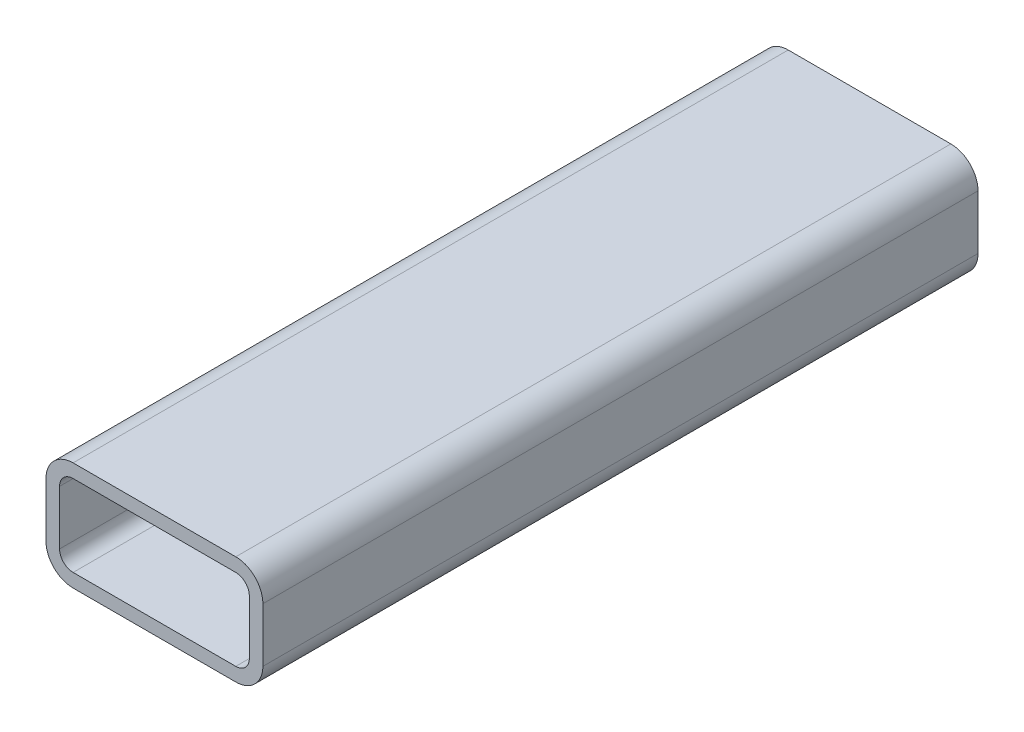
ISO-10303-21;
HEADER;
FILE_DESCRIPTION(('STEP AP214'),'2;1');
FILE_NAME('part.step','',(''),(''),'','','');
FILE_SCHEMA(('AUTOMOTIVE_DESIGN { 1 0 10303 214 1 1 1 1 }'));
ENDSEC;
DATA;
#1=APPLICATION_CONTEXT('core data for automotive mechanical design processes');
#2=APPLICATION_PROTOCOL_DEFINITION('international standard','automotive_design',2000,#1);
#3=PRODUCT_CONTEXT('',#1,'mechanical');
#4=PRODUCT('Part','Part','',(#3));
#5=PRODUCT_RELATED_PRODUCT_CATEGORY('part','',(#4));
#6=PRODUCT_DEFINITION_FORMATION('','',#4);
#7=PRODUCT_DEFINITION_CONTEXT('part definition',#1,'design');
#8=PRODUCT_DEFINITION('design','',#6,#7);
#9=PRODUCT_DEFINITION_SHAPE('','',#8);
#10=(LENGTH_UNIT() NAMED_UNIT(*) SI_UNIT(.MILLI.,.METRE.));
#11=(NAMED_UNIT(*) PLANE_ANGLE_UNIT() SI_UNIT($,.RADIAN.));
#12=(NAMED_UNIT(*) SI_UNIT($,.STERADIAN.) SOLID_ANGLE_UNIT());
#13=UNCERTAINTY_MEASURE_WITH_UNIT(LENGTH_MEASURE(1.E-05),#10,'distance_accuracy_value','');
#14=(GEOMETRIC_REPRESENTATION_CONTEXT(3) GLOBAL_UNCERTAINTY_ASSIGNED_CONTEXT((#13)) GLOBAL_UNIT_ASSIGNED_CONTEXT((#10,
#11,#12)) REPRESENTATION_CONTEXT('',''));
#15=CARTESIAN_POINT('',(0.,0.,0.));
#16=DIRECTION('',(0.,0.,1.));
#17=DIRECTION('',(1.,0.,0.));
#18=AXIS2_PLACEMENT_3D('',#15,#16,#17);
#19=CARTESIAN_POINT('',(76.2,25.4,670.));
#20=DIRECTION('',(0.,0.,1.));
#21=DIRECTION('',(1.,0.,0.));
#22=AXIS2_PLACEMENT_3D('',#19,#20,#21);
#23=PLANE('',#22);
#24=CARTESIAN_POINT('',(76.2,25.4,670.));
#25=DIRECTION('',(0.,0.,1.));
#26=DIRECTION('',(1.,0.,0.));
#27=AXIS2_PLACEMENT_3D('',#24,#25,#26);
#28=CIRCLE('',#27,25.4);
#29=CARTESIAN_POINT('',(101.6,25.3999999999999,670.));
#30=VERTEX_POINT('',#29);
#31=CARTESIAN_POINT('',(76.2,50.8,670.));
#32=VERTEX_POINT('',#31);
#33=EDGE_CURVE('E210',#30,#32,#28,.T.);
#34=ORIENTED_EDGE('',*,*,#33,.T.);
#35=DIRECTION('',(-1.,0.,0.));
#36=VECTOR('',#35,1.);
#37=CARTESIAN_POINT('',(76.2,50.8,670.));
#38=LINE('',#37,#36);
#39=CARTESIAN_POINT('',(-76.2,50.8,670.));
#40=VERTEX_POINT('',#39);
#41=EDGE_CURVE('E213',#32,#40,#38,.T.);
#42=ORIENTED_EDGE('',*,*,#41,.T.);
#43=CARTESIAN_POINT('',(-76.2,25.4,670.));
#44=DIRECTION('',(0.,0.,1.));
#45=DIRECTION('',(1.,0.,0.));
#46=AXIS2_PLACEMENT_3D('',#43,#44,#45);
#47=CIRCLE('',#46,25.4);
#48=CARTESIAN_POINT('',(-101.6,25.4,670.));
#49=VERTEX_POINT('',#48);
#50=EDGE_CURVE('E216',#40,#49,#47,.T.);
#51=ORIENTED_EDGE('',*,*,#50,.T.);
#52=DIRECTION('',(0.,-1.,0.));
#53=VECTOR('',#52,1.);
#54=CARTESIAN_POINT('',(-101.6,-25.4,670.));
#55=LINE('',#54,#53);
#56=CARTESIAN_POINT('',(-101.6,-25.4,670.));
#57=VERTEX_POINT('',#56);
#58=EDGE_CURVE('E218',#49,#57,#55,.T.);
#59=ORIENTED_EDGE('',*,*,#58,.T.);
#60=CARTESIAN_POINT('',(-76.2,-25.4,670.));
#61=DIRECTION('',(0.,0.,1.));
#62=DIRECTION('',(1.,0.,0.));
#63=AXIS2_PLACEMENT_3D('',#60,#61,#62);
#64=CIRCLE('',#63,25.4);
#65=CARTESIAN_POINT('',(-76.2,-50.8,670.));
#66=VERTEX_POINT('',#65);
#67=EDGE_CURVE('E220',#57,#66,#64,.T.);
#68=ORIENTED_EDGE('',*,*,#67,.T.);
#69=DIRECTION('',(1.,0.,0.));
#70=VECTOR('',#69,1.);
#71=CARTESIAN_POINT('',(-76.2,-50.8,670.));
#72=LINE('',#71,#70);
#73=CARTESIAN_POINT('',(76.2,-50.8000000000001,670.));
#74=VERTEX_POINT('',#73);
#75=EDGE_CURVE('E222',#66,#74,#72,.T.);
#76=ORIENTED_EDGE('',*,*,#75,.T.);
#77=CARTESIAN_POINT('',(76.2,-25.4,670.));
#78=DIRECTION('',(0.,0.,1.));
#79=DIRECTION('',(1.,0.,0.));
#80=AXIS2_PLACEMENT_3D('',#77,#78,#79);
#81=CIRCLE('',#80,25.4);
#82=CARTESIAN_POINT('',(101.6,-25.4000000000001,670.));
#83=VERTEX_POINT('',#82);
#84=EDGE_CURVE('E224',#74,#83,#81,.T.);
#85=ORIENTED_EDGE('',*,*,#84,.T.);
#86=DIRECTION('',(0.,1.,0.));
#87=VECTOR('',#86,1.);
#88=CARTESIAN_POINT('',(101.6,25.3999999999999,670.));
#89=LINE('',#88,#87);
#90=EDGE_CURVE('E226',#83,#30,#89,.T.);
#91=ORIENTED_EDGE('',*,*,#90,.T.);
#92=EDGE_LOOP('',(#34,#42,#51,#59,#68,#76,#85,#91));
#93=FACE_BOUND('',#92,.T.);
#94=DIRECTION('',(0.,-1.,0.));
#95=VECTOR('',#94,1.);
#96=CARTESIAN_POINT('',(-88.8999999999999,-25.4,670.));
#97=LINE('',#96,#95);
#98=CARTESIAN_POINT('',(-88.8999999999999,25.4,670.));
#99=VERTEX_POINT('',#98);
#100=CARTESIAN_POINT('',(-88.8999999999999,-25.4,670.));
#101=VERTEX_POINT('',#100);
#102=EDGE_CURVE('E153',#99,#101,#97,.T.);
#103=ORIENTED_EDGE('',*,*,#102,.F.);
#104=CARTESIAN_POINT('',(-76.2,25.4,670.));
#105=DIRECTION('',(0.,0.,1.));
#106=DIRECTION('',(1.,0.,0.));
#107=AXIS2_PLACEMENT_3D('',#104,#105,#106);
#108=CIRCLE('',#107,12.7);
#109=CARTESIAN_POINT('',(-76.2,38.1,670.));
#110=VERTEX_POINT('',#109);
#111=EDGE_CURVE('E145',#110,#99,#108,.T.);
#112=ORIENTED_EDGE('',*,*,#111,.F.);
#113=DIRECTION('',(-1.,0.,0.));
#114=VECTOR('',#113,1.);
#115=CARTESIAN_POINT('',(76.2,38.1,670.));
#116=LINE('',#115,#114);
#117=CARTESIAN_POINT('',(76.2,38.1,670.));
#118=VERTEX_POINT('',#117);
#119=EDGE_CURVE('E178',#118,#110,#116,.T.);
#120=ORIENTED_EDGE('',*,*,#119,.F.);
#121=CARTESIAN_POINT('',(76.2,25.4,670.));
#122=DIRECTION('',(0.,0.,1.));
#123=DIRECTION('',(1.,0.,0.));
#124=AXIS2_PLACEMENT_3D('',#121,#122,#123);
#125=CIRCLE('',#124,12.7);
#126=CARTESIAN_POINT('',(88.8999999999999,25.4,670.));
#127=VERTEX_POINT('',#126);
#128=EDGE_CURVE('E176',#127,#118,#125,.T.);
#129=ORIENTED_EDGE('',*,*,#128,.F.);
#130=DIRECTION('',(0.,1.,0.));
#131=VECTOR('',#130,1.);
#132=CARTESIAN_POINT('',(88.8999999999999,25.4,670.));
#133=LINE('',#132,#131);
#134=CARTESIAN_POINT('',(88.8999999999999,-25.4,670.));
#135=VERTEX_POINT('',#134);
#136=EDGE_CURVE('E174',#135,#127,#133,.T.);
#137=ORIENTED_EDGE('',*,*,#136,.F.);
#138=CARTESIAN_POINT('',(76.2,-25.4,670.));
#139=DIRECTION('',(0.,0.,1.));
#140=DIRECTION('',(1.,0.,0.));
#141=AXIS2_PLACEMENT_3D('',#138,#139,#140);
#142=CIRCLE('',#141,12.7);
#143=CARTESIAN_POINT('',(76.2,-38.1,670.));
#144=VERTEX_POINT('',#143);
#145=EDGE_CURVE('E172',#144,#135,#142,.T.);
#146=ORIENTED_EDGE('',*,*,#145,.F.);
#147=DIRECTION('',(1.,0.,0.));
#148=VECTOR('',#147,1.);
#149=CARTESIAN_POINT('',(-76.2,-38.1,670.));
#150=LINE('',#149,#148);
#151=CARTESIAN_POINT('',(-76.2,-38.1,670.));
#152=VERTEX_POINT('',#151);
#153=EDGE_CURVE('E168',#152,#144,#150,.T.);
#154=ORIENTED_EDGE('',*,*,#153,.F.);
#155=CARTESIAN_POINT('',(-76.2,-25.4,670.));
#156=DIRECTION('',(0.,0.,1.));
#157=DIRECTION('',(1.,0.,0.));
#158=AXIS2_PLACEMENT_3D('',#155,#156,#157);
#159=CIRCLE('',#158,12.7);
#160=EDGE_CURVE('E166',#101,#152,#159,.T.);
#161=ORIENTED_EDGE('',*,*,#160,.F.);
#162=EDGE_LOOP('',(#103,#112,#120,#129,#137,#146,#154,#161));
#163=FACE_BOUND('',#162,.T.);
#164=ADVANCED_FACE('F32',(#93,#163),#23,.T.);
#165=CARTESIAN_POINT('',(76.2,25.4,0.));
#166=DIRECTION('',(0.,0.,1.));
#167=DIRECTION('',(1.,0.,0.));
#168=AXIS2_PLACEMENT_3D('',#165,#166,#167);
#169=PLANE('',#168);
#170=CARTESIAN_POINT('',(76.2,25.4,0.));
#171=DIRECTION('',(0.,0.,1.));
#172=DIRECTION('',(1.,0.,0.));
#173=AXIS2_PLACEMENT_3D('',#170,#171,#172);
#174=CIRCLE('',#173,25.4);
#175=CARTESIAN_POINT('',(101.6,25.3999999999999,0.));
#176=VERTEX_POINT('',#175);
#177=CARTESIAN_POINT('',(76.2,50.8,0.));
#178=VERTEX_POINT('',#177);
#179=EDGE_CURVE('E161',#176,#178,#174,.T.);
#180=ORIENTED_EDGE('',*,*,#179,.F.);
#181=DIRECTION('',(0.,1.,0.));
#182=VECTOR('',#181,1.);
#183=CARTESIAN_POINT('',(101.6,25.3999999999999,0.));
#184=LINE('',#183,#182);
#185=CARTESIAN_POINT('',(101.6,-25.4000000000001,0.));
#186=VERTEX_POINT('',#185);
#187=EDGE_CURVE('E214',#186,#176,#184,.T.);
#188=ORIENTED_EDGE('',*,*,#187,.F.);
#189=CARTESIAN_POINT('',(76.2,-25.4,0.));
#190=DIRECTION('',(0.,0.,1.));
#191=DIRECTION('',(1.,0.,0.));
#192=AXIS2_PLACEMENT_3D('',#189,#190,#191);
#193=CIRCLE('',#192,25.4);
#194=CARTESIAN_POINT('',(76.2,-50.8000000000001,0.));
#195=VERTEX_POINT('',#194);
#196=EDGE_CURVE('E241',#195,#186,#193,.T.);
#197=ORIENTED_EDGE('',*,*,#196,.F.);
#198=DIRECTION('',(1.,0.,0.));
#199=VECTOR('',#198,1.);
#200=CARTESIAN_POINT('',(-76.2,-50.8,0.));
#201=LINE('',#200,#199);
#202=CARTESIAN_POINT('',(-76.2,-50.8,0.));
#203=VERTEX_POINT('',#202);
#204=EDGE_CURVE('E239',#203,#195,#201,.T.);
#205=ORIENTED_EDGE('',*,*,#204,.F.);
#206=CARTESIAN_POINT('',(-76.2,-25.4,0.));
#207=DIRECTION('',(0.,0.,1.));
#208=DIRECTION('',(1.,0.,0.));
#209=AXIS2_PLACEMENT_3D('',#206,#207,#208);
#210=CIRCLE('',#209,25.4);
#211=CARTESIAN_POINT('',(-101.6,-25.4,0.));
#212=VERTEX_POINT('',#211);
#213=EDGE_CURVE('E237',#212,#203,#210,.T.);
#214=ORIENTED_EDGE('',*,*,#213,.F.);
#215=DIRECTION('',(0.,-1.,0.));
#216=VECTOR('',#215,1.);
#217=CARTESIAN_POINT('',(-101.6,-25.4,0.));
#218=LINE('',#217,#216);
#219=CARTESIAN_POINT('',(-101.6,25.4,0.));
#220=VERTEX_POINT('',#219);
#221=EDGE_CURVE('E235',#220,#212,#218,.T.);
#222=ORIENTED_EDGE('',*,*,#221,.F.);
#223=CARTESIAN_POINT('',(-76.2,25.4,0.));
#224=DIRECTION('',(0.,0.,1.));
#225=DIRECTION('',(1.,0.,0.));
#226=AXIS2_PLACEMENT_3D('',#223,#224,#225);
#227=CIRCLE('',#226,25.4);
#228=CARTESIAN_POINT('',(-76.2,50.8,0.));
#229=VERTEX_POINT('',#228);
#230=EDGE_CURVE('E233',#229,#220,#227,.T.);
#231=ORIENTED_EDGE('',*,*,#230,.F.);
#232=DIRECTION('',(-1.,0.,0.));
#233=VECTOR('',#232,1.);
#234=CARTESIAN_POINT('',(76.2,50.8,0.));
#235=LINE('',#234,#233);
#236=EDGE_CURVE('E231',#178,#229,#235,.T.);
#237=ORIENTED_EDGE('',*,*,#236,.F.);
#238=EDGE_LOOP('',(#180,#188,#197,#205,#214,#222,#231,#237));
#239=FACE_BOUND('',#238,.T.);
#240=CARTESIAN_POINT('',(-76.2,25.4,0.));
#241=DIRECTION('',(0.,0.,1.));
#242=DIRECTION('',(1.,0.,0.));
#243=AXIS2_PLACEMENT_3D('',#240,#241,#242);
#244=CIRCLE('',#243,12.7);
#245=CARTESIAN_POINT('',(-76.2,38.1,0.));
#246=VERTEX_POINT('',#245);
#247=CARTESIAN_POINT('',(-88.8999999999999,25.4,0.));
#248=VERTEX_POINT('',#247);
#249=EDGE_CURVE('E55',#246,#248,#244,.T.);
#250=ORIENTED_EDGE('',*,*,#249,.T.);
#251=DIRECTION('',(0.,-1.,0.));
#252=VECTOR('',#251,1.);
#253=CARTESIAN_POINT('',(-88.8999999999999,-25.4,0.));
#254=LINE('',#253,#252);
#255=CARTESIAN_POINT('',(-88.8999999999999,-25.4,0.));
#256=VERTEX_POINT('',#255);
#257=EDGE_CURVE('E160',#248,#256,#254,.T.);
#258=ORIENTED_EDGE('',*,*,#257,.T.);
#259=CARTESIAN_POINT('',(-76.2,-25.4,0.));
#260=DIRECTION('',(0.,0.,1.));
#261=DIRECTION('',(1.,0.,0.));
#262=AXIS2_PLACEMENT_3D('',#259,#260,#261);
#263=CIRCLE('',#262,12.7);
#264=CARTESIAN_POINT('',(-76.2,-38.1,0.));
#265=VERTEX_POINT('',#264);
#266=EDGE_CURVE('E182',#256,#265,#263,.T.);
#267=ORIENTED_EDGE('',*,*,#266,.T.);
#268=DIRECTION('',(1.,0.,0.));
#269=VECTOR('',#268,1.);
#270=CARTESIAN_POINT('',(-76.2,-38.1,0.));
#271=LINE('',#270,#269);
#272=CARTESIAN_POINT('',(76.2,-38.1,0.));
#273=VERTEX_POINT('',#272);
#274=EDGE_CURVE('E185',#265,#273,#271,.T.);
#275=ORIENTED_EDGE('',*,*,#274,.T.);
#276=CARTESIAN_POINT('',(76.2,-25.4,0.));
#277=DIRECTION('',(0.,0.,1.));
#278=DIRECTION('',(1.,0.,0.));
#279=AXIS2_PLACEMENT_3D('',#276,#277,#278);
#280=CIRCLE('',#279,12.7);
#281=CARTESIAN_POINT('',(88.8999999999999,-25.4,0.));
#282=VERTEX_POINT('',#281);
#283=EDGE_CURVE('E188',#273,#282,#280,.T.);
#284=ORIENTED_EDGE('',*,*,#283,.T.);
#285=DIRECTION('',(0.,1.,0.));
#286=VECTOR('',#285,1.);
#287=CARTESIAN_POINT('',(88.8999999999999,25.4,0.));
#288=LINE('',#287,#286);
#289=CARTESIAN_POINT('',(88.8999999999999,25.4,0.));
#290=VERTEX_POINT('',#289);
#291=EDGE_CURVE('E191',#282,#290,#288,.T.);
#292=ORIENTED_EDGE('',*,*,#291,.T.);
#293=CARTESIAN_POINT('',(76.2,25.4,0.));
#294=DIRECTION('',(0.,0.,1.));
#295=DIRECTION('',(1.,0.,0.));
#296=AXIS2_PLACEMENT_3D('',#293,#294,#295);
#297=CIRCLE('',#296,12.7);
#298=CARTESIAN_POINT('',(76.2,38.1,0.));
#299=VERTEX_POINT('',#298);
#300=EDGE_CURVE('E194',#290,#299,#297,.T.);
#301=ORIENTED_EDGE('',*,*,#300,.T.);
#302=DIRECTION('',(-1.,0.,0.));
#303=VECTOR('',#302,1.);
#304=CARTESIAN_POINT('',(76.2,38.1,0.));
#305=LINE('',#304,#303);
#306=EDGE_CURVE('E154',#299,#246,#305,.T.);
#307=ORIENTED_EDGE('',*,*,#306,.T.);
#308=EDGE_LOOP('',(#250,#258,#267,#275,#284,#292,#301,#307));
#309=FACE_BOUND('',#308,.T.);
#310=ADVANCED_FACE('F271',(#239,#309),#169,.F.);
#311=CARTESIAN_POINT('',(76.2,25.4,670.));
#312=DIRECTION('',(0.,0.,-1.));
#313=DIRECTION('',(-1.,0.,0.));
#314=AXIS2_PLACEMENT_3D('',#311,#312,#313);
#315=CYLINDRICAL_SURFACE('',#314,25.4);
#316=ORIENTED_EDGE('',*,*,#179,.T.);
#317=DIRECTION('',(0.,0.,-1.));
#318=VECTOR('',#317,1.);
#319=CARTESIAN_POINT('',(76.2,50.8,670.));
#320=LINE('',#319,#318);
#321=EDGE_CURVE('E11',#32,#178,#320,.T.);
#322=ORIENTED_EDGE('',*,*,#321,.F.);
#323=ORIENTED_EDGE('',*,*,#33,.F.);
#324=DIRECTION('',(0.,0.,-1.));
#325=VECTOR('',#324,1.);
#326=CARTESIAN_POINT('',(101.6,25.3999999999999,670.));
#327=LINE('',#326,#325);
#328=EDGE_CURVE('E228',#30,#176,#327,.T.);
#329=ORIENTED_EDGE('',*,*,#328,.T.);
#330=EDGE_LOOP('',(#316,#322,#323,#329));
#331=FACE_BOUND('',#330,.T.);
#332=ADVANCED_FACE('F34',(#331),#315,.T.);
#333=CARTESIAN_POINT('',(76.2,50.8,670.));
#334=DIRECTION('',(0.,-1.,0.));
#335=DIRECTION('',(1.,0.,0.));
#336=AXIS2_PLACEMENT_3D('',#333,#334,#335);
#337=PLANE('',#336);
#338=ORIENTED_EDGE('',*,*,#236,.T.);
#339=DIRECTION('',(0.,0.,-1.));
#340=VECTOR('',#339,1.);
#341=CARTESIAN_POINT('',(-76.2,50.8,670.));
#342=LINE('',#341,#340);
#343=EDGE_CURVE('E40',#40,#229,#342,.T.);
#344=ORIENTED_EDGE('',*,*,#343,.F.);
#345=ORIENTED_EDGE('',*,*,#41,.F.);
#346=ORIENTED_EDGE('',*,*,#321,.T.);
#347=EDGE_LOOP('',(#338,#344,#345,#346));
#348=FACE_BOUND('',#347,.T.);
#349=ADVANCED_FACE('F288',(#348),#337,.F.);
#350=CARTESIAN_POINT('',(-76.2,25.4,670.));
#351=DIRECTION('',(0.,0.,-1.));
#352=DIRECTION('',(-1.,0.,0.));
#353=AXIS2_PLACEMENT_3D('',#350,#351,#352);
#354=CYLINDRICAL_SURFACE('',#353,25.4);
#355=ORIENTED_EDGE('',*,*,#230,.T.);
#356=DIRECTION('',(0.,0.,-1.));
#357=VECTOR('',#356,1.);
#358=CARTESIAN_POINT('',(-101.6,25.4,670.));
#359=LINE('',#358,#357);
#360=EDGE_CURVE('E258',#49,#220,#359,.T.);
#361=ORIENTED_EDGE('',*,*,#360,.F.);
#362=ORIENTED_EDGE('',*,*,#50,.F.);
#363=ORIENTED_EDGE('',*,*,#343,.T.);
#364=EDGE_LOOP('',(#355,#361,#362,#363));
#365=FACE_BOUND('',#364,.T.);
#366=ADVANCED_FACE('F265',(#365),#354,.T.);
#367=CARTESIAN_POINT('',(-101.6,-25.4,670.));
#368=DIRECTION('',(1.,0.,0.));
#369=DIRECTION('',(0.,1.,0.));
#370=AXIS2_PLACEMENT_3D('',#367,#368,#369);
#371=PLANE('',#370);
#372=ORIENTED_EDGE('',*,*,#221,.T.);
#373=DIRECTION('',(0.,0.,-1.));
#374=VECTOR('',#373,1.);
#375=CARTESIAN_POINT('',(-101.6,-25.4,670.));
#376=LINE('',#375,#374);
#377=EDGE_CURVE('E255',#57,#212,#376,.T.);
#378=ORIENTED_EDGE('',*,*,#377,.F.);
#379=ORIENTED_EDGE('',*,*,#58,.F.);
#380=ORIENTED_EDGE('',*,*,#360,.T.);
#381=EDGE_LOOP('',(#372,#378,#379,#380));
#382=FACE_BOUND('',#381,.T.);
#383=ADVANCED_FACE('F277',(#382),#371,.F.);
#384=CARTESIAN_POINT('',(-76.2,-25.4,670.));
#385=DIRECTION('',(0.,0.,-1.));
#386=DIRECTION('',(-1.,0.,0.));
#387=AXIS2_PLACEMENT_3D('',#384,#385,#386);
#388=CYLINDRICAL_SURFACE('',#387,25.4);
#389=ORIENTED_EDGE('',*,*,#213,.T.);
#390=DIRECTION('',(0.,0.,-1.));
#391=VECTOR('',#390,1.);
#392=CARTESIAN_POINT('',(-76.2,-50.8,670.));
#393=LINE('',#392,#391);
#394=EDGE_CURVE('E252',#66,#203,#393,.T.);
#395=ORIENTED_EDGE('',*,*,#394,.F.);
#396=ORIENTED_EDGE('',*,*,#67,.F.);
#397=ORIENTED_EDGE('',*,*,#377,.T.);
#398=EDGE_LOOP('',(#389,#395,#396,#397));
#399=FACE_BOUND('',#398,.T.);
#400=ADVANCED_FACE('F281',(#399),#388,.T.);
#401=CARTESIAN_POINT('',(-76.2,-50.8,670.));
#402=DIRECTION('',(0.,1.,0.));
#403=DIRECTION('',(-1.,0.,0.));
#404=AXIS2_PLACEMENT_3D('',#401,#402,#403);
#405=PLANE('',#404);
#406=ORIENTED_EDGE('',*,*,#204,.T.);
#407=DIRECTION('',(0.,0.,-1.));
#408=VECTOR('',#407,1.);
#409=CARTESIAN_POINT('',(76.2,-50.8000000000001,670.));
#410=LINE('',#409,#408);
#411=EDGE_CURVE('E249',#74,#195,#410,.T.);
#412=ORIENTED_EDGE('',*,*,#411,.F.);
#413=ORIENTED_EDGE('',*,*,#75,.F.);
#414=ORIENTED_EDGE('',*,*,#394,.T.);
#415=EDGE_LOOP('',(#406,#412,#413,#414));
#416=FACE_BOUND('',#415,.T.);
#417=ADVANCED_FACE('F301',(#416),#405,.F.);
#418=CARTESIAN_POINT('',(76.2,-25.4,670.));
#419=DIRECTION('',(0.,0.,-1.));
#420=DIRECTION('',(-1.,0.,0.));
#421=AXIS2_PLACEMENT_3D('',#418,#419,#420);
#422=CYLINDRICAL_SURFACE('',#421,25.4);
#423=ORIENTED_EDGE('',*,*,#196,.T.);
#424=DIRECTION('',(0.,0.,-1.));
#425=VECTOR('',#424,1.);
#426=CARTESIAN_POINT('',(101.6,-25.4000000000001,670.));
#427=LINE('',#426,#425);
#428=EDGE_CURVE('E246',#83,#186,#427,.T.);
#429=ORIENTED_EDGE('',*,*,#428,.F.);
#430=ORIENTED_EDGE('',*,*,#84,.F.);
#431=ORIENTED_EDGE('',*,*,#411,.T.);
#432=EDGE_LOOP('',(#423,#429,#430,#431));
#433=FACE_BOUND('',#432,.T.);
#434=ADVANCED_FACE('F299',(#433),#422,.T.);
#435=CARTESIAN_POINT('',(101.6,25.3999999999999,670.));
#436=DIRECTION('',(-1.,0.,0.));
#437=DIRECTION('',(0.,-1.,0.));
#438=AXIS2_PLACEMENT_3D('',#435,#436,#437);
#439=PLANE('',#438);
#440=ORIENTED_EDGE('',*,*,#187,.T.);
#441=ORIENTED_EDGE('',*,*,#328,.F.);
#442=ORIENTED_EDGE('',*,*,#90,.F.);
#443=ORIENTED_EDGE('',*,*,#428,.T.);
#444=EDGE_LOOP('',(#440,#441,#442,#443));
#445=FACE_BOUND('',#444,.T.);
#446=ADVANCED_FACE('F294',(#445),#439,.F.);
#447=CARTESIAN_POINT('',(-76.2,25.4,670.));
#448=DIRECTION('',(0.,0.,-1.));
#449=DIRECTION('',(-1.,0.,0.));
#450=AXIS2_PLACEMENT_3D('',#447,#448,#449);
#451=CYLINDRICAL_SURFACE('',#450,12.7);
#452=ORIENTED_EDGE('',*,*,#249,.F.);
#453=DIRECTION('',(0.,0.,-1.));
#454=VECTOR('',#453,1.);
#455=CARTESIAN_POINT('',(-76.2,38.1,670.));
#456=LINE('',#455,#454);
#457=EDGE_CURVE('E149',#110,#246,#456,.T.);
#458=ORIENTED_EDGE('',*,*,#457,.F.);
#459=ORIENTED_EDGE('',*,*,#111,.T.);
#460=DIRECTION('',(0.,0.,-1.));
#461=VECTOR('',#460,1.);
#462=CARTESIAN_POINT('',(-88.8999999999999,25.4,670.));
#463=LINE('',#462,#461);
#464=EDGE_CURVE('E148',#99,#248,#463,.T.);
#465=ORIENTED_EDGE('',*,*,#464,.T.);
#466=EDGE_LOOP('',(#452,#458,#459,#465));
#467=FACE_BOUND('',#466,.T.);
#468=ADVANCED_FACE('F147',(#467),#451,.F.);
#469=CARTESIAN_POINT('',(-88.8999999999999,-25.4,670.));
#470=DIRECTION('',(1.,0.,0.));
#471=DIRECTION('',(0.,0.,-1.));
#472=AXIS2_PLACEMENT_3D('',#469,#470,#471);
#473=PLANE('',#472);
#474=ORIENTED_EDGE('',*,*,#257,.F.);
#475=ORIENTED_EDGE('',*,*,#464,.F.);
#476=ORIENTED_EDGE('',*,*,#102,.T.);
#477=DIRECTION('',(0.,0.,-1.));
#478=VECTOR('',#477,1.);
#479=CARTESIAN_POINT('',(-88.8999999999999,-25.4,670.));
#480=LINE('',#479,#478);
#481=EDGE_CURVE('E162',#101,#256,#480,.T.);
#482=ORIENTED_EDGE('',*,*,#481,.T.);
#483=EDGE_LOOP('',(#474,#475,#476,#482));
#484=FACE_BOUND('',#483,.T.);
#485=ADVANCED_FACE('F157',(#484),#473,.T.);
#486=CARTESIAN_POINT('',(-76.2,-25.4,670.));
#487=DIRECTION('',(0.,0.,-1.));
#488=DIRECTION('',(-1.,0.,0.));
#489=AXIS2_PLACEMENT_3D('',#486,#487,#488);
#490=CYLINDRICAL_SURFACE('',#489,12.7);
#491=ORIENTED_EDGE('',*,*,#266,.F.);
#492=ORIENTED_EDGE('',*,*,#481,.F.);
#493=ORIENTED_EDGE('',*,*,#160,.T.);
#494=DIRECTION('',(0.,0.,-1.));
#495=VECTOR('',#494,1.);
#496=CARTESIAN_POINT('',(-76.2,-38.1,670.));
#497=LINE('',#496,#495);
#498=EDGE_CURVE('E207',#152,#265,#497,.T.);
#499=ORIENTED_EDGE('',*,*,#498,.T.);
#500=EDGE_LOOP('',(#491,#492,#493,#499));
#501=FACE_BOUND('',#500,.T.);
#502=ADVANCED_FACE('F326',(#501),#490,.F.);
#503=CARTESIAN_POINT('',(-76.2,-38.1,670.));
#504=DIRECTION('',(0.,1.,0.));
#505=DIRECTION('',(-1.,0.,0.));
#506=AXIS2_PLACEMENT_3D('',#503,#504,#505);
#507=PLANE('',#506);
#508=ORIENTED_EDGE('',*,*,#274,.F.);
#509=ORIENTED_EDGE('',*,*,#498,.F.);
#510=ORIENTED_EDGE('',*,*,#153,.T.);
#511=DIRECTION('',(0.,0.,-1.));
#512=VECTOR('',#511,1.);
#513=CARTESIAN_POINT('',(76.2,-38.1,670.));
#514=LINE('',#513,#512);
#515=EDGE_CURVE('E205',#144,#273,#514,.T.);
#516=ORIENTED_EDGE('',*,*,#515,.T.);
#517=EDGE_LOOP('',(#508,#509,#510,#516));
#518=FACE_BOUND('',#517,.T.);
#519=ADVANCED_FACE('F330',(#518),#507,.T.);
#520=CARTESIAN_POINT('',(76.2,-25.4,670.));
#521=DIRECTION('',(0.,0.,-1.));
#522=DIRECTION('',(-1.,0.,0.));
#523=AXIS2_PLACEMENT_3D('',#520,#521,#522);
#524=CYLINDRICAL_SURFACE('',#523,12.7);
#525=ORIENTED_EDGE('',*,*,#283,.F.);
#526=ORIENTED_EDGE('',*,*,#515,.F.);
#527=ORIENTED_EDGE('',*,*,#145,.T.);
#528=DIRECTION('',(0.,0.,-1.));
#529=VECTOR('',#528,1.);
#530=CARTESIAN_POINT('',(88.8999999999999,-25.4,670.));
#531=LINE('',#530,#529);
#532=EDGE_CURVE('E203',#135,#282,#531,.T.);
#533=ORIENTED_EDGE('',*,*,#532,.T.);
#534=EDGE_LOOP('',(#525,#526,#527,#533));
#535=FACE_BOUND('',#534,.T.);
#536=ADVANCED_FACE('F336',(#535),#524,.F.);
#537=CARTESIAN_POINT('',(88.8999999999999,25.4,670.));
#538=DIRECTION('',(-1.,0.,0.));
#539=DIRECTION('',(0.,0.,1.));
#540=AXIS2_PLACEMENT_3D('',#537,#538,#539);
#541=PLANE('',#540);
#542=ORIENTED_EDGE('',*,*,#291,.F.);
#543=ORIENTED_EDGE('',*,*,#532,.F.);
#544=ORIENTED_EDGE('',*,*,#136,.T.);
#545=DIRECTION('',(0.,0.,-1.));
#546=VECTOR('',#545,1.);
#547=CARTESIAN_POINT('',(88.8999999999999,25.4,670.));
#548=LINE('',#547,#546);
#549=EDGE_CURVE('E201',#127,#290,#548,.T.);
#550=ORIENTED_EDGE('',*,*,#549,.T.);
#551=EDGE_LOOP('',(#542,#543,#544,#550));
#552=FACE_BOUND('',#551,.T.);
#553=ADVANCED_FACE('F340',(#552),#541,.T.);
#554=CARTESIAN_POINT('',(76.2,25.4,670.));
#555=DIRECTION('',(0.,0.,-1.));
#556=DIRECTION('',(-1.,0.,0.));
#557=AXIS2_PLACEMENT_3D('',#554,#555,#556);
#558=CYLINDRICAL_SURFACE('',#557,12.7);
#559=ORIENTED_EDGE('',*,*,#300,.F.);
#560=ORIENTED_EDGE('',*,*,#549,.F.);
#561=ORIENTED_EDGE('',*,*,#128,.T.);
#562=DIRECTION('',(0.,0.,-1.));
#563=VECTOR('',#562,1.);
#564=CARTESIAN_POINT('',(76.2,38.1,670.));
#565=LINE('',#564,#563);
#566=EDGE_CURVE('E47',#118,#299,#565,.T.);
#567=ORIENTED_EDGE('',*,*,#566,.T.);
#568=EDGE_LOOP('',(#559,#560,#561,#567));
#569=FACE_BOUND('',#568,.T.);
#570=ADVANCED_FACE('F344',(#569),#558,.F.);
#571=CARTESIAN_POINT('',(76.2,38.1,670.));
#572=DIRECTION('',(0.,-1.,0.));
#573=DIRECTION('',(1.,0.,0.));
#574=AXIS2_PLACEMENT_3D('',#571,#572,#573);
#575=PLANE('',#574);
#576=ORIENTED_EDGE('',*,*,#306,.F.);
#577=ORIENTED_EDGE('',*,*,#566,.F.);
#578=ORIENTED_EDGE('',*,*,#119,.T.);
#579=ORIENTED_EDGE('',*,*,#457,.T.);
#580=EDGE_LOOP('',(#576,#577,#578,#579));
#581=FACE_BOUND('',#580,.T.);
#582=ADVANCED_FACE('F348',(#581),#575,.T.);
#583=CLOSED_SHELL('',(#164,#310,#332,#349,#366,#383,#400,#417,#434,#446,#468,#485,#502,#519,
#536,#553,#570,#582));
#584=MANIFOLD_SOLID_BREP('B2',#583);
#585=ADVANCED_BREP_SHAPE_REPRESENTATION('',(#18,#584),#14);
#586=SHAPE_DEFINITION_REPRESENTATION(#9,#585);
ENDSEC;
END-ISO-10303-21;
